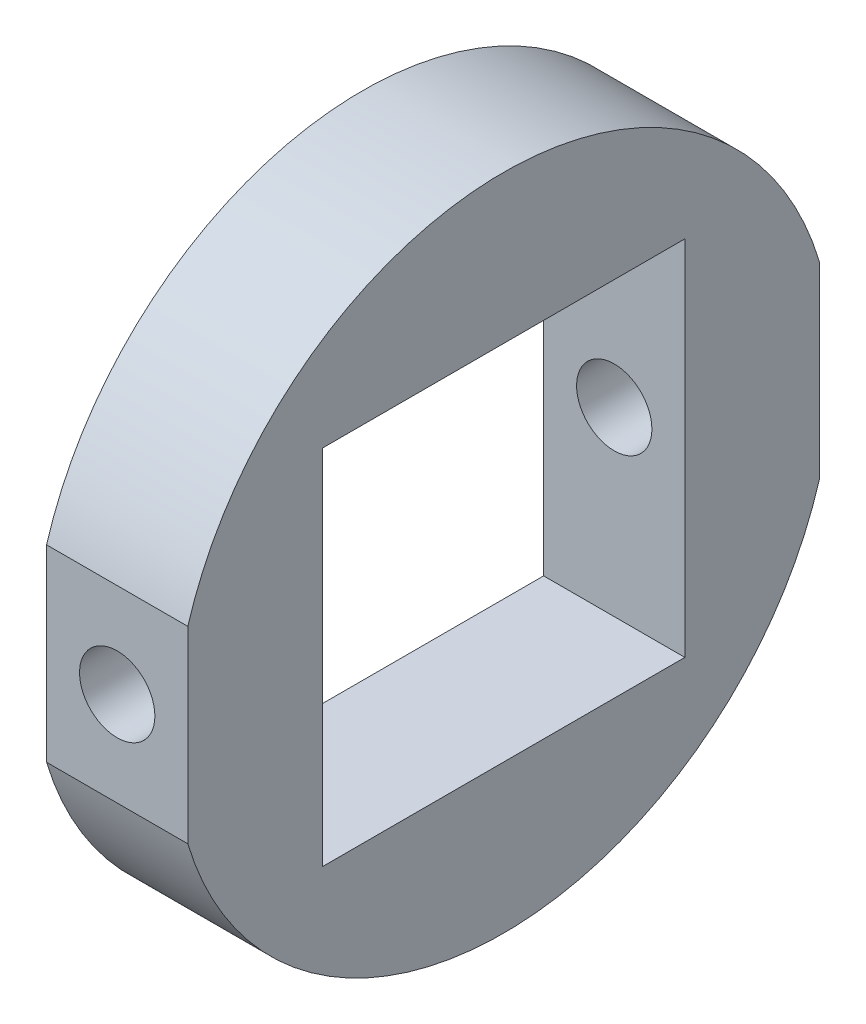
ISO-10303-21;
HEADER;
FILE_DESCRIPTION(('STEP AP214'),'2;1');
FILE_NAME('part.step','',(''),(''),'','','');
FILE_SCHEMA(('AUTOMOTIVE_DESIGN { 1 0 10303 214 1 1 1 1 }'));
ENDSEC;
DATA;
#1=APPLICATION_CONTEXT('core data for automotive mechanical design processes');
#2=APPLICATION_PROTOCOL_DEFINITION('international standard','automotive_design',2000,#1);
#3=PRODUCT_CONTEXT('',#1,'mechanical');
#4=PRODUCT('Part','Part','',(#3));
#5=PRODUCT_RELATED_PRODUCT_CATEGORY('part','',(#4));
#6=PRODUCT_DEFINITION_FORMATION('','',#4);
#7=PRODUCT_DEFINITION_CONTEXT('part definition',#1,'design');
#8=PRODUCT_DEFINITION('design','',#6,#7);
#9=PRODUCT_DEFINITION_SHAPE('','',#8);
#10=(LENGTH_UNIT() NAMED_UNIT(*) SI_UNIT(.MILLI.,.METRE.));
#11=(NAMED_UNIT(*) PLANE_ANGLE_UNIT() SI_UNIT($,.RADIAN.));
#12=(NAMED_UNIT(*) SI_UNIT($,.STERADIAN.) SOLID_ANGLE_UNIT());
#13=UNCERTAINTY_MEASURE_WITH_UNIT(LENGTH_MEASURE(1.E-05),#10,'distance_accuracy_value','');
#14=(GEOMETRIC_REPRESENTATION_CONTEXT(3) GLOBAL_UNCERTAINTY_ASSIGNED_CONTEXT((#13)) GLOBAL_UNIT_ASSIGNED_CONTEXT((#10,
#11,#12)) REPRESENTATION_CONTEXT('',''));
#15=CARTESIAN_POINT('',(0.,0.,0.));
#16=DIRECTION('',(0.,0.,1.));
#17=DIRECTION('',(1.,0.,0.));
#18=AXIS2_PLACEMENT_3D('',#15,#16,#17);
#19=CARTESIAN_POINT('',(3.,0.,0.));
#20=DIRECTION('',(1.,0.,0.));
#21=DIRECTION('',(0.,0.,-1.));
#22=AXIS2_PLACEMENT_3D('',#19,#20,#21);
#23=PLANE('',#22);
#24=CARTESIAN_POINT('',(3.,0.,0.));
#25=DIRECTION('',(1.,0.,0.));
#26=DIRECTION('',(0.,0.,-1.));
#27=AXIS2_PLACEMENT_3D('',#24,#25,#26);
#28=CIRCLE('',#27,14.);
#29=CARTESIAN_POINT('',(3.,4.,-13.4164078649987));
#30=VERTEX_POINT('',#29);
#31=CARTESIAN_POINT('',(3.,4.,13.4164078649987));
#32=VERTEX_POINT('',#31);
#33=EDGE_CURVE('E139',#30,#32,#28,.T.);
#34=ORIENTED_EDGE('',*,*,#33,.T.);
#35=DIRECTION('',(0.,-1.,0.));
#36=VECTOR('',#35,1.);
#37=CARTESIAN_POINT('',(3.,4.,13.4164078649987));
#38=LINE('',#37,#36);
#39=CARTESIAN_POINT('',(3.,-4.,13.4164078649987));
#40=VERTEX_POINT('',#39);
#41=EDGE_CURVE('E142',#32,#40,#38,.T.);
#42=ORIENTED_EDGE('',*,*,#41,.T.);
#43=CARTESIAN_POINT('',(3.,0.,0.));
#44=DIRECTION('',(1.,0.,0.));
#45=DIRECTION('',(0.,0.,-1.));
#46=AXIS2_PLACEMENT_3D('',#43,#44,#45);
#47=CIRCLE('',#46,14.);
#48=CARTESIAN_POINT('',(3.,-4.,-13.4164078649987));
#49=VERTEX_POINT('',#48);
#50=EDGE_CURVE('E145',#40,#49,#47,.T.);
#51=ORIENTED_EDGE('',*,*,#50,.T.);
#52=DIRECTION('',(0.,1.,0.));
#53=VECTOR('',#52,1.);
#54=CARTESIAN_POINT('',(3.,4.,-13.4164078649987));
#55=LINE('',#54,#53);
#56=EDGE_CURVE('E147',#49,#30,#55,.T.);
#57=ORIENTED_EDGE('',*,*,#56,.T.);
#58=EDGE_LOOP('',(#34,#42,#51,#57));
#59=FACE_BOUND('',#58,.T.);
#60=DIRECTION('',(0.,0.,1.));
#61=VECTOR('',#60,1.);
#62=CARTESIAN_POINT('',(3.,7.7,7.7));
#63=LINE('',#62,#61);
#64=CARTESIAN_POINT('',(3.,7.7,-7.7));
#65=VERTEX_POINT('',#64);
#66=CARTESIAN_POINT('',(3.,7.7,7.7));
#67=VERTEX_POINT('',#66);
#68=EDGE_CURVE('E109',#65,#67,#63,.T.);
#69=ORIENTED_EDGE('',*,*,#68,.F.);
#70=DIRECTION('',(0.,1.,0.));
#71=VECTOR('',#70,1.);
#72=CARTESIAN_POINT('',(3.,7.7,-7.7));
#73=LINE('',#72,#71);
#74=CARTESIAN_POINT('',(3.,-7.7,-7.7));
#75=VERTEX_POINT('',#74);
#76=EDGE_CURVE('E101',#75,#65,#73,.T.);
#77=ORIENTED_EDGE('',*,*,#76,.F.);
#78=DIRECTION('',(0.,0.,-1.));
#79=VECTOR('',#78,1.);
#80=CARTESIAN_POINT('',(3.,-7.7,7.7));
#81=LINE('',#80,#79);
#82=CARTESIAN_POINT('',(3.,-7.7,7.7));
#83=VERTEX_POINT('',#82);
#84=EDGE_CURVE('E123',#83,#75,#81,.T.);
#85=ORIENTED_EDGE('',*,*,#84,.F.);
#86=DIRECTION('',(0.,-1.,0.));
#87=VECTOR('',#86,1.);
#88=CARTESIAN_POINT('',(3.,7.7,7.7));
#89=LINE('',#88,#87);
#90=EDGE_CURVE('E121',#67,#83,#89,.T.);
#91=ORIENTED_EDGE('',*,*,#90,.F.);
#92=EDGE_LOOP('',(#69,#77,#85,#91));
#93=FACE_BOUND('',#92,.T.);
#94=ADVANCED_FACE('F35',(#59,#93),#23,.T.);
#95=CARTESIAN_POINT('',(-3.,0.,0.));
#96=DIRECTION('',(1.,0.,0.));
#97=DIRECTION('',(0.,0.,-1.));
#98=AXIS2_PLACEMENT_3D('',#95,#96,#97);
#99=PLANE('',#98);
#100=CARTESIAN_POINT('',(-3.,0.,0.));
#101=DIRECTION('',(1.,0.,0.));
#102=DIRECTION('',(0.,0.,-1.));
#103=AXIS2_PLACEMENT_3D('',#100,#101,#102);
#104=CIRCLE('',#103,14.);
#105=CARTESIAN_POINT('',(-3.,4.,-13.4164078649987));
#106=VERTEX_POINT('',#105);
#107=CARTESIAN_POINT('',(-3.,4.,13.4164078649987));
#108=VERTEX_POINT('',#107);
#109=EDGE_CURVE('E117',#106,#108,#104,.T.);
#110=ORIENTED_EDGE('',*,*,#109,.F.);
#111=DIRECTION('',(0.,1.,0.));
#112=VECTOR('',#111,1.);
#113=CARTESIAN_POINT('',(-3.,4.,-13.4164078649987));
#114=LINE('',#113,#112);
#115=CARTESIAN_POINT('',(-3.,-4.,-13.4164078649987));
#116=VERTEX_POINT('',#115);
#117=EDGE_CURVE('E143',#116,#106,#114,.T.);
#118=ORIENTED_EDGE('',*,*,#117,.F.);
#119=CARTESIAN_POINT('',(-3.,0.,0.));
#120=DIRECTION('',(1.,0.,0.));
#121=DIRECTION('',(0.,0.,-1.));
#122=AXIS2_PLACEMENT_3D('',#119,#120,#121);
#123=CIRCLE('',#122,14.);
#124=CARTESIAN_POINT('',(-3.,-4.,13.4164078649987));
#125=VERTEX_POINT('',#124);
#126=EDGE_CURVE('E154',#125,#116,#123,.T.);
#127=ORIENTED_EDGE('',*,*,#126,.F.);
#128=DIRECTION('',(0.,-1.,0.));
#129=VECTOR('',#128,1.);
#130=CARTESIAN_POINT('',(-3.,4.,13.4164078649987));
#131=LINE('',#130,#129);
#132=EDGE_CURVE('E152',#108,#125,#131,.T.);
#133=ORIENTED_EDGE('',*,*,#132,.F.);
#134=EDGE_LOOP('',(#110,#118,#127,#133));
#135=FACE_BOUND('',#134,.T.);
#136=DIRECTION('',(0.,1.,0.));
#137=VECTOR('',#136,1.);
#138=CARTESIAN_POINT('',(-3.,7.7,-7.7));
#139=LINE('',#138,#137);
#140=CARTESIAN_POINT('',(-3.,-7.7,-7.7));
#141=VERTEX_POINT('',#140);
#142=CARTESIAN_POINT('',(-3.,7.7,-7.7));
#143=VERTEX_POINT('',#142);
#144=EDGE_CURVE('E59',#141,#143,#139,.T.);
#145=ORIENTED_EDGE('',*,*,#144,.T.);
#146=DIRECTION('',(0.,0.,1.));
#147=VECTOR('',#146,1.);
#148=CARTESIAN_POINT('',(-3.,7.7,7.7));
#149=LINE('',#148,#147);
#150=CARTESIAN_POINT('',(-3.,7.7,7.7));
#151=VERTEX_POINT('',#150);
#152=EDGE_CURVE('E116',#143,#151,#149,.T.);
#153=ORIENTED_EDGE('',*,*,#152,.T.);
#154=DIRECTION('',(0.,-1.,0.));
#155=VECTOR('',#154,1.);
#156=CARTESIAN_POINT('',(-3.,7.7,7.7));
#157=LINE('',#156,#155);
#158=CARTESIAN_POINT('',(-3.,-7.7,7.7));
#159=VERTEX_POINT('',#158);
#160=EDGE_CURVE('E131',#151,#159,#157,.T.);
#161=ORIENTED_EDGE('',*,*,#160,.T.);
#162=DIRECTION('',(0.,0.,-1.));
#163=VECTOR('',#162,1.);
#164=CARTESIAN_POINT('',(-3.,-7.7,7.7));
#165=LINE('',#164,#163);
#166=EDGE_CURVE('E110',#159,#141,#165,.T.);
#167=ORIENTED_EDGE('',*,*,#166,.T.);
#168=EDGE_LOOP('',(#145,#153,#161,#167));
#169=FACE_BOUND('',#168,.T.);
#170=ADVANCED_FACE('F173',(#135,#169),#99,.F.);
#171=CARTESIAN_POINT('',(3.,0.,0.));
#172=DIRECTION('',(-1.,0.,0.));
#173=DIRECTION('',(0.,0.,1.));
#174=AXIS2_PLACEMENT_3D('',#171,#172,#173);
#175=CYLINDRICAL_SURFACE('',#174,14.);
#176=ORIENTED_EDGE('',*,*,#109,.T.);
#177=DIRECTION('',(-1.,0.,0.));
#178=VECTOR('',#177,1.);
#179=CARTESIAN_POINT('',(3.,4.,13.4164078649987));
#180=LINE('',#179,#178);
#181=EDGE_CURVE('E11',#32,#108,#180,.T.);
#182=ORIENTED_EDGE('',*,*,#181,.F.);
#183=ORIENTED_EDGE('',*,*,#33,.F.);
#184=DIRECTION('',(-1.,0.,0.));
#185=VECTOR('',#184,1.);
#186=CARTESIAN_POINT('',(3.,4.,-13.4164078649987));
#187=LINE('',#186,#185);
#188=EDGE_CURVE('E149',#30,#106,#187,.T.);
#189=ORIENTED_EDGE('',*,*,#188,.T.);
#190=EDGE_LOOP('',(#176,#182,#183,#189));
#191=FACE_BOUND('',#190,.T.);
#192=ADVANCED_FACE('F37',(#191),#175,.T.);
#193=CARTESIAN_POINT('',(3.,4.,13.4164078649987));
#194=DIRECTION('',(0.,0.,-1.));
#195=DIRECTION('',(-1.,0.,0.));
#196=AXIS2_PLACEMENT_3D('',#193,#194,#195);
#197=PLANE('',#196);
#198=CARTESIAN_POINT('',(0.,0.,13.4164078649987));
#199=DIRECTION('',(0.,0.,1.));
#200=DIRECTION('',(1.,0.,0.));
#201=AXIS2_PLACEMENT_3D('',#198,#199,#200);
#202=CIRCLE('',#201,1.6);
#203=CARTESIAN_POINT('',(1.6,0.,13.4164078649987));
#204=VERTEX_POINT('',#203);
#205=EDGE_CURVE('E211',#204,#204,#202,.T.);
#206=ORIENTED_EDGE('',*,*,#205,.F.);
#207=EDGE_LOOP('',(#206));
#208=FACE_BOUND('',#207,.T.);
#209=ORIENTED_EDGE('',*,*,#132,.T.);
#210=DIRECTION('',(-1.,0.,0.));
#211=VECTOR('',#210,1.);
#212=CARTESIAN_POINT('',(3.,-4.,13.4164078649987));
#213=LINE('',#212,#211);
#214=EDGE_CURVE('E44',#40,#125,#213,.T.);
#215=ORIENTED_EDGE('',*,*,#214,.F.);
#216=ORIENTED_EDGE('',*,*,#41,.F.);
#217=ORIENTED_EDGE('',*,*,#181,.T.);
#218=EDGE_LOOP('',(#209,#215,#216,#217));
#219=FACE_BOUND('',#218,.T.);
#220=ADVANCED_FACE('F183',(#208,#219),#197,.F.);
#221=CARTESIAN_POINT('',(3.,0.,0.));
#222=DIRECTION('',(-1.,0.,0.));
#223=DIRECTION('',(0.,0.,1.));
#224=AXIS2_PLACEMENT_3D('',#221,#222,#223);
#225=CYLINDRICAL_SURFACE('',#224,14.);
#226=ORIENTED_EDGE('',*,*,#126,.T.);
#227=DIRECTION('',(-1.,0.,0.));
#228=VECTOR('',#227,1.);
#229=CARTESIAN_POINT('',(3.,-4.,-13.4164078649987));
#230=LINE('',#229,#228);
#231=EDGE_CURVE('E159',#49,#116,#230,.T.);
#232=ORIENTED_EDGE('',*,*,#231,.F.);
#233=ORIENTED_EDGE('',*,*,#50,.F.);
#234=ORIENTED_EDGE('',*,*,#214,.T.);
#235=EDGE_LOOP('',(#226,#232,#233,#234));
#236=FACE_BOUND('',#235,.T.);
#237=ADVANCED_FACE('F167',(#236),#225,.T.);
#238=CARTESIAN_POINT('',(3.,4.,-13.4164078649987));
#239=DIRECTION('',(0.,0.,1.));
#240=DIRECTION('',(1.,0.,0.));
#241=AXIS2_PLACEMENT_3D('',#238,#239,#240);
#242=PLANE('',#241);
#243=CARTESIAN_POINT('',(0.,0.,-13.4164078649987));
#244=DIRECTION('',(0.,0.,1.));
#245=DIRECTION('',(1.,0.,0.));
#246=AXIS2_PLACEMENT_3D('',#243,#244,#245);
#247=CIRCLE('',#246,1.6);
#248=CARTESIAN_POINT('',(1.6,0.,-13.4164078649987));
#249=VERTEX_POINT('',#248);
#250=EDGE_CURVE('E209',#249,#249,#247,.T.);
#251=ORIENTED_EDGE('',*,*,#250,.T.);
#252=EDGE_LOOP('',(#251));
#253=FACE_BOUND('',#252,.T.);
#254=ORIENTED_EDGE('',*,*,#117,.T.);
#255=ORIENTED_EDGE('',*,*,#188,.F.);
#256=ORIENTED_EDGE('',*,*,#56,.F.);
#257=ORIENTED_EDGE('',*,*,#231,.T.);
#258=EDGE_LOOP('',(#254,#255,#256,#257));
#259=FACE_BOUND('',#258,.T.);
#260=ADVANCED_FACE('F177',(#253,#259),#242,.F.);
#261=CARTESIAN_POINT('',(3.,7.7,-7.7));
#262=DIRECTION('',(0.,0.,1.));
#263=DIRECTION('',(0.,-1.,0.));
#264=AXIS2_PLACEMENT_3D('',#261,#262,#263);
#265=PLANE('',#264);
#266=CARTESIAN_POINT('',(0.,0.,-7.7));
#267=DIRECTION('',(0.,0.,1.));
#268=DIRECTION('',(0.,-1.,0.));
#269=AXIS2_PLACEMENT_3D('',#266,#267,#268);
#270=CIRCLE('',#269,1.6);
#271=CARTESIAN_POINT('',(0.,-1.6,-7.7));
#272=VERTEX_POINT('',#271);
#273=EDGE_CURVE('E129',#272,#272,#270,.T.);
#274=ORIENTED_EDGE('',*,*,#273,.F.);
#275=EDGE_LOOP('',(#274));
#276=FACE_BOUND('',#275,.T.);
#277=ORIENTED_EDGE('',*,*,#144,.F.);
#278=DIRECTION('',(-1.,0.,0.));
#279=VECTOR('',#278,1.);
#280=CARTESIAN_POINT('',(3.,-7.7,-7.7));
#281=LINE('',#280,#279);
#282=EDGE_CURVE('E105',#75,#141,#281,.T.);
#283=ORIENTED_EDGE('',*,*,#282,.F.);
#284=ORIENTED_EDGE('',*,*,#76,.T.);
#285=DIRECTION('',(-1.,0.,0.));
#286=VECTOR('',#285,1.);
#287=CARTESIAN_POINT('',(3.,7.7,-7.7));
#288=LINE('',#287,#286);
#289=EDGE_CURVE('E104',#65,#143,#288,.T.);
#290=ORIENTED_EDGE('',*,*,#289,.T.);
#291=EDGE_LOOP('',(#277,#283,#284,#290));
#292=FACE_BOUND('',#291,.T.);
#293=ADVANCED_FACE('F103',(#276,#292),#265,.T.);
#294=CARTESIAN_POINT('',(3.,7.7,7.7));
#295=DIRECTION('',(0.,-1.,0.));
#296=DIRECTION('',(0.,0.,-1.));
#297=AXIS2_PLACEMENT_3D('',#294,#295,#296);
#298=PLANE('',#297);
#299=ORIENTED_EDGE('',*,*,#152,.F.);
#300=ORIENTED_EDGE('',*,*,#289,.F.);
#301=ORIENTED_EDGE('',*,*,#68,.T.);
#302=DIRECTION('',(-1.,0.,0.));
#303=VECTOR('',#302,1.);
#304=CARTESIAN_POINT('',(3.,7.7,7.7));
#305=LINE('',#304,#303);
#306=EDGE_CURVE('E118',#67,#151,#305,.T.);
#307=ORIENTED_EDGE('',*,*,#306,.T.);
#308=EDGE_LOOP('',(#299,#300,#301,#307));
#309=FACE_BOUND('',#308,.T.);
#310=ADVANCED_FACE('F113',(#309),#298,.T.);
#311=CARTESIAN_POINT('',(3.,7.7,7.7));
#312=DIRECTION('',(0.,0.,-1.));
#313=DIRECTION('',(0.,1.,0.));
#314=AXIS2_PLACEMENT_3D('',#311,#312,#313);
#315=PLANE('',#314);
#316=CARTESIAN_POINT('',(0.,0.,7.7));
#317=DIRECTION('',(0.,0.,-1.));
#318=DIRECTION('',(0.,1.,0.));
#319=AXIS2_PLACEMENT_3D('',#316,#317,#318);
#320=CIRCLE('',#319,1.6);
#321=CARTESIAN_POINT('',(0.,1.6,7.7));
#322=VERTEX_POINT('',#321);
#323=EDGE_CURVE('E39',#322,#322,#320,.T.);
#324=ORIENTED_EDGE('',*,*,#323,.F.);
#325=EDGE_LOOP('',(#324));
#326=FACE_BOUND('',#325,.T.);
#327=ORIENTED_EDGE('',*,*,#160,.F.);
#328=ORIENTED_EDGE('',*,*,#306,.F.);
#329=ORIENTED_EDGE('',*,*,#90,.T.);
#330=DIRECTION('',(-1.,0.,0.));
#331=VECTOR('',#330,1.);
#332=CARTESIAN_POINT('',(3.,-7.7,7.7));
#333=LINE('',#332,#331);
#334=EDGE_CURVE('E51',#83,#159,#333,.T.);
#335=ORIENTED_EDGE('',*,*,#334,.T.);
#336=EDGE_LOOP('',(#327,#328,#329,#335));
#337=FACE_BOUND('',#336,.T.);
#338=ADVANCED_FACE('F231',(#326,#337),#315,.T.);
#339=CARTESIAN_POINT('',(3.,-7.7,7.7));
#340=DIRECTION('',(0.,1.,0.));
#341=DIRECTION('',(0.,0.,1.));
#342=AXIS2_PLACEMENT_3D('',#339,#340,#341);
#343=PLANE('',#342);
#344=ORIENTED_EDGE('',*,*,#166,.F.);
#345=ORIENTED_EDGE('',*,*,#334,.F.);
#346=ORIENTED_EDGE('',*,*,#84,.T.);
#347=ORIENTED_EDGE('',*,*,#282,.T.);
#348=EDGE_LOOP('',(#344,#345,#346,#347));
#349=FACE_BOUND('',#348,.T.);
#350=ADVANCED_FACE('F226',(#349),#343,.T.);
#351=CARTESIAN_POINT('',(0.,0.,-13.4164078649987));
#352=DIRECTION('',(0.,0.,1.));
#353=DIRECTION('',(1.,0.,0.));
#354=AXIS2_PLACEMENT_3D('',#351,#352,#353);
#355=CYLINDRICAL_SURFACE('',#354,1.6);
#356=ORIENTED_EDGE('',*,*,#323,.T.);
#357=EDGE_LOOP('',(#356));
#358=FACE_BOUND('',#357,.T.);
#359=ORIENTED_EDGE('',*,*,#205,.T.);
#360=EDGE_LOOP('',(#359));
#361=FACE_BOUND('',#360,.T.);
#362=ADVANCED_FACE('F221',(#358,#361),#355,.F.);
#363=ORIENTED_EDGE('',*,*,#273,.T.);
#364=EDGE_LOOP('',(#363));
#365=FACE_BOUND('',#364,.T.);
#366=ORIENTED_EDGE('',*,*,#250,.F.);
#367=EDGE_LOOP('',(#366));
#368=FACE_BOUND('',#367,.T.);
#369=ADVANCED_FACE('F219',(#365,#368),#355,.F.);
#370=CLOSED_SHELL('',(#94,#170,#192,#220,#237,#260,#293,#310,#338,#350,#362,#369));
#371=MANIFOLD_SOLID_BREP('B2',#370);
#372=ADVANCED_BREP_SHAPE_REPRESENTATION('',(#18,#371),#14);
#373=SHAPE_DEFINITION_REPRESENTATION(#9,#372);
ENDSEC;
END-ISO-10303-21;
